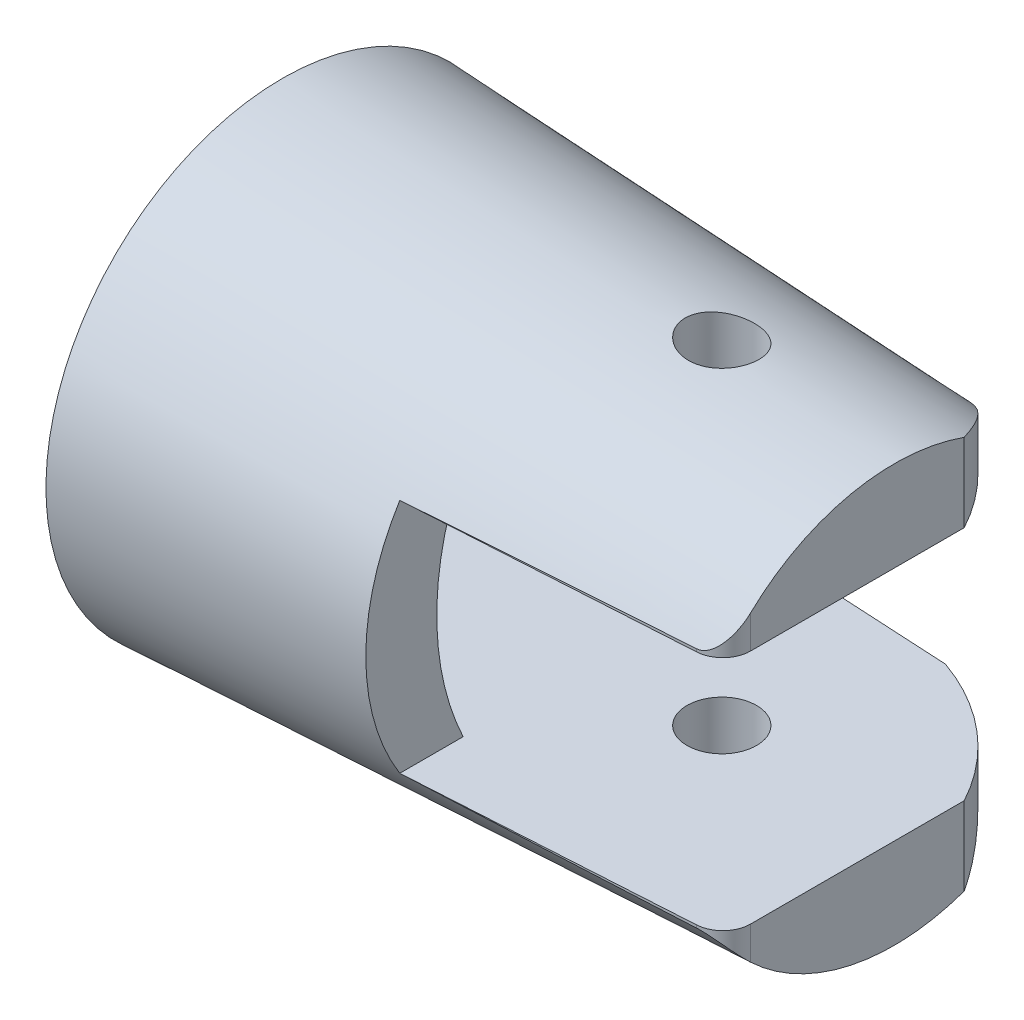
ISO-10303-21;
HEADER;
FILE_DESCRIPTION(('STEP AP214'),'2;1');
FILE_NAME('part.step','',(''),(''),'','','');
FILE_SCHEMA(('AUTOMOTIVE_DESIGN { 1 0 10303 214 1 1 1 1 }'));
ENDSEC;
DATA;
#1=APPLICATION_CONTEXT('core data for automotive mechanical design processes');
#2=APPLICATION_PROTOCOL_DEFINITION('international standard','automotive_design',2000,#1);
#3=PRODUCT_CONTEXT('',#1,'mechanical');
#4=PRODUCT('Part','Part','',(#3));
#5=PRODUCT_RELATED_PRODUCT_CATEGORY('part','',(#4));
#6=PRODUCT_DEFINITION_FORMATION('','',#4);
#7=PRODUCT_DEFINITION_CONTEXT('part definition',#1,'design');
#8=PRODUCT_DEFINITION('design','',#6,#7);
#9=PRODUCT_DEFINITION_SHAPE('','',#8);
#10=(LENGTH_UNIT() NAMED_UNIT(*) SI_UNIT(.MILLI.,.METRE.));
#11=(NAMED_UNIT(*) PLANE_ANGLE_UNIT() SI_UNIT($,.RADIAN.));
#12=(NAMED_UNIT(*) SI_UNIT($,.STERADIAN.) SOLID_ANGLE_UNIT());
#13=UNCERTAINTY_MEASURE_WITH_UNIT(LENGTH_MEASURE(1.E-05),#10,'distance_accuracy_value','');
#14=(GEOMETRIC_REPRESENTATION_CONTEXT(3) GLOBAL_UNCERTAINTY_ASSIGNED_CONTEXT((#13)) GLOBAL_UNIT_ASSIGNED_CONTEXT((#10,
#11,#12)) REPRESENTATION_CONTEXT('',''));
#15=CARTESIAN_POINT('',(0.,0.,0.));
#16=DIRECTION('',(0.,0.,1.));
#17=DIRECTION('',(1.,0.,0.));
#18=AXIS2_PLACEMENT_3D('',#15,#16,#17);
#19=CARTESIAN_POINT('',(9.1685,3.542375,8.335));
#20=DIRECTION('',(1.,0.,0.));
#21=DIRECTION('',(0.,1.,0.));
#22=AXIS2_PLACEMENT_3D('',#19,#20,#21);
#23=PLANE('',#22);
#24=CARTESIAN_POINT('',(9.1685,0.,3.79403656817905));
#25=DIRECTION('',(1.,0.,0.));
#26=DIRECTION('',(0.,1.,0.));
#27=AXIS2_PLACEMENT_3D('',#24,#25,#26);
#28=CIRCLE('',#27,8.335);
#29=CARTESIAN_POINT('',(9.1685,-3.542375,-3.75075));
#30=VERTEX_POINT('',#29);
#31=CARTESIAN_POINT('',(9.1685,3.542375,-3.75075));
#32=VERTEX_POINT('',#31);
#33=EDGE_CURVE('E359',#30,#32,#28,.T.);
#34=ORIENTED_EDGE('',*,*,#33,.F.);
#35=DIRECTION('',(0.,0.,-1.));
#36=VECTOR('',#35,1.);
#37=CARTESIAN_POINT('',(9.1685,-3.542375,8.335));
#38=LINE('',#37,#36);
#39=CARTESIAN_POINT('',(9.1685,-3.542375,-5.64923033336179));
#40=VERTEX_POINT('',#39);
#41=EDGE_CURVE('E238',#30,#40,#38,.T.);
#42=ORIENTED_EDGE('',*,*,#41,.T.);
#43=CARTESIAN_POINT('',(9.1685,0.,0.));
#44=DIRECTION('',(1.,0.,0.));
#45=DIRECTION('',(0.,1.,0.));
#46=AXIS2_PLACEMENT_3D('',#43,#44,#45);
#47=CIRCLE('',#46,6.668);
#48=CARTESIAN_POINT('',(9.1685,3.542375,-5.64923033336179));
#49=VERTEX_POINT('',#48);
#50=EDGE_CURVE('E272',#49,#40,#47,.F.);
#51=ORIENTED_EDGE('',*,*,#50,.F.);
#52=DIRECTION('',(0.,0.,-1.));
#53=VECTOR('',#52,1.);
#54=CARTESIAN_POINT('',(9.1685,3.542375,8.335));
#55=LINE('',#54,#53);
#56=EDGE_CURVE('E243',#32,#49,#55,.T.);
#57=ORIENTED_EDGE('',*,*,#56,.F.);
#58=EDGE_LOOP('',(#34,#42,#51,#57));
#59=FACE_BOUND('',#58,.T.);
#60=ADVANCED_FACE('F37',(#59),#23,.T.);
#61=CARTESIAN_POINT('',(18.337,0.,0.));
#62=DIRECTION('',(-1.,0.,0.));
#63=DIRECTION('',(0.,0.,1.));
#64=AXIS2_PLACEMENT_3D('',#61,#62,#63);
#65=CONICAL_SURFACE('',#64,6.25125,0.0454232794215771);
#66=CARTESIAN_POINT('',(11.9975330316849,6.44021012387023,-1.13470048100918));
#67=CARTESIAN_POINT('',(12.037952493262,6.4308558428648,-1.17720393330202));
#68=CARTESIAN_POINT('',(12.0819888325155,6.42149143549023,-1.21631099414914));
#69=CARTESIAN_POINT('',(12.1761312335468,6.40340763861985,-1.28663655344195));
#70=CARTESIAN_POINT('',(12.2262428039587,6.39468884623862,-1.31784781213434));
#71=CARTESIAN_POINT('',(12.3312160875977,6.37852745058636,-1.37145131256486));
#72=CARTESIAN_POINT('',(12.386080377955,6.37108554630071,-1.39383873265955));
#73=CARTESIAN_POINT('',(12.4989956879317,6.35802492288397,-1.4290291027239));
#74=CARTESIAN_POINT('',(12.5570456520128,6.35240560407275,-1.44183520702256));
#75=CARTESIAN_POINT('',(12.6735963327101,6.34344893443878,-1.45726107121429));
#76=CARTESIAN_POINT('',(12.7320704785145,6.34007261713358,-1.46005868827308));
#77=CARTESIAN_POINT('',(12.848747969712,6.3356068055509,-1.45581514446099));
#78=CARTESIAN_POINT('',(12.9069513385645,6.33451710934135,-1.44877485246977));
#79=CARTESIAN_POINT('',(13.0201837629493,6.33456640943373,-1.42528923992671));
#80=CARTESIAN_POINT('',(13.0752533258961,6.33566046655478,-1.40903838944566));
#81=CARTESIAN_POINT('',(13.1819197905906,6.33973990971466,-1.36775780258779));
#82=CARTESIAN_POINT('',(13.233516610143,6.34272534050235,-1.34272785850864));
#83=CARTESIAN_POINT('',(13.3320838940549,6.35020838574408,-1.28447022966754));
#84=CARTESIAN_POINT('',(13.3790294621528,6.35471362312732,-1.25120144940273));
#85=CARTESIAN_POINT('',(13.4667587398816,6.36473194111713,-1.17746913946979));
#86=CARTESIAN_POINT('',(13.5075417817911,6.37024513079445,-1.13700483118495));
#87=CARTESIAN_POINT('',(13.5826196016023,6.38185425225326,-1.04912065680532));
#88=CARTESIAN_POINT('',(13.6167719067789,6.38795947129503,-1.00158024866946));
#89=CARTESIAN_POINT('',(13.6766549374508,6.40010736520847,-0.901452902173634));
#90=CARTESIAN_POINT('',(13.7023851834252,6.40615003649995,-0.848865676686993));
#91=CARTESIAN_POINT('',(13.7449007349513,6.41774446913314,-0.739570215099756));
#92=CARTESIAN_POINT('',(13.7616012197386,6.42329118030254,-0.68282839974948));
#93=CARTESIAN_POINT('',(13.7851817529798,6.43345104876565,-0.567258567713423));
#94=CARTESIAN_POINT('',(13.7920622436878,6.43806424809303,-0.508430645100016));
#95=CARTESIAN_POINT('',(13.795751470416,6.44610357321565,-0.390779390799092));
#96=CARTESIAN_POINT('',(13.7926281620983,6.44953753366838,-0.33195873105426));
#97=CARTESIAN_POINT('',(13.7765132530748,6.45520708413869,-0.215626773011869));
#98=CARTESIAN_POINT('',(13.7635220726245,6.45744272518371,-0.158115419060677));
#99=CARTESIAN_POINT('',(13.7281658913844,6.46081455774399,-0.046510565799345));
#100=CARTESIAN_POINT('',(13.7058744153958,6.461959146547,0.00760599330426392));
#101=CARTESIAN_POINT('',(13.6525531547727,6.46342849305815,0.1113597436933));
#102=CARTESIAN_POINT('',(13.6215232645148,6.46375324085619,0.160996880825237));
#103=CARTESIAN_POINT('',(13.5515644116032,6.46393316605158,0.254435134525583));
#104=CARTESIAN_POINT('',(13.5126269922696,6.46378783822324,0.298229919223822));
#105=CARTESIAN_POINT('',(13.4279720543599,6.46342871926718,0.37868609950355));
#106=CARTESIAN_POINT('',(13.3822544229344,6.46321492699986,0.41534737633189));
#107=CARTESIAN_POINT('',(13.2851742946482,6.46311620378835,0.480605151965648));
#108=CARTESIAN_POINT('',(13.2337944760281,6.46323231051294,0.509175892137362));
#109=CARTESIAN_POINT('',(13.1269726331767,6.46413609702289,0.557284070790961));
#110=CARTESIAN_POINT('',(13.0715306985112,6.4649237620051,0.576821708374861));
#111=CARTESIAN_POINT('',(12.9582801269343,6.46739805682936,0.606282522627947));
#112=CARTESIAN_POINT('',(12.900476177745,6.46908297899969,0.6162238623417));
#113=CARTESIAN_POINT('',(12.7840571332848,6.47343317499165,0.626286192883299));
#114=CARTESIAN_POINT('',(12.7254420448322,6.47609844057766,0.626407266206895));
#115=CARTESIAN_POINT('',(12.6091427663491,6.48232542626046,0.616854308475685));
#116=CARTESIAN_POINT('',(12.5514574664258,6.48588597787264,0.607192995558153));
#117=CARTESIAN_POINT('',(12.4385509422697,6.49367009410953,0.57838964641172));
#118=CARTESIAN_POINT('',(12.3833298244154,6.49789368732217,0.559247201314009));
#119=CARTESIAN_POINT('',(12.2765955821272,6.50666126424595,0.511903439297456));
#120=CARTESIAN_POINT('',(12.225103455783,6.5112068141797,0.483655072133273));
#121=CARTESIAN_POINT('',(12.1275739195341,6.52013409032122,0.418914096025429));
#122=CARTESIAN_POINT('',(12.0815367135128,6.52451581040148,0.382421179081254));
#123=CARTESIAN_POINT('',(11.9960572404014,6.5326199258377,0.30205134708437));
#124=CARTESIAN_POINT('',(11.9566383968411,6.53633998209702,0.258149264680629));
#125=CARTESIAN_POINT('',(11.8857316713161,6.54259599230176,0.164273995844016));
#126=CARTESIAN_POINT('',(11.8542433078782,6.54513201813971,0.114301178249198));
#127=CARTESIAN_POINT('',(11.8003762245188,6.54856626687841,0.0101844086340991));
#128=CARTESIAN_POINT('',(11.7779179155512,6.54947905306855,-0.043917864653984));
#129=CARTESIAN_POINT('',(11.7423739631063,6.54940476809697,-0.155113236054785));
#130=CARTESIAN_POINT('',(11.7292870846525,6.54841794733063,-0.2122059390211));
#131=CARTESIAN_POINT('',(11.7129611433757,6.54443029012817,-0.326918044188915));
#132=CARTESIAN_POINT('',(11.7095908610613,6.54145696442354,-0.384519786951312));
#133=CARTESIAN_POINT('',(11.7123684390474,6.53356665061155,-0.499367582517678));
#134=CARTESIAN_POINT('',(11.7185180068507,6.52864931393961,-0.556613569663341));
#135=CARTESIAN_POINT('',(11.740108842098,6.51707939569347,-0.669266000352423));
#136=CARTESIAN_POINT('',(11.7555704654358,6.51042303075347,-0.724668132487182));
#137=CARTESIAN_POINT('',(11.7952904164828,6.49575894284288,-0.831994045862872));
#138=CARTESIAN_POINT('',(11.8195422289184,6.48775222309714,-0.883920369684549));
#139=CARTESIAN_POINT('',(11.8686313878517,6.4731149647341,-0.969882231732448));
#140=CARTESIAN_POINT('',(11.8916226257924,6.46667942178841,-1.00502097416058));
#141=CARTESIAN_POINT('',(11.9416384258958,6.45356768815016,-1.07225094762394));
#142=CARTESIAN_POINT('',(11.9686631288509,6.44689148906342,-1.10434207221483));
#143=CARTESIAN_POINT('',(11.9975330316849,6.44021012387023,-1.13470048100918));
#144=B_SPLINE_CURVE_WITH_KNOTS('',3,(#66,#67,#68,#69,#70,#71,#72,#73,#74,#75,#76,#77,#78,#79,
#80,#81,#82,#83,#84,#85,#86,#87,#88,#89,#90,#91,#92,#93,#94,#95,#96,#97,#98,#99,#100,#101,#102,
#103,#104,#105,#106,#107,#108,#109,#110,#111,#112,#113,#114,#115,#116,#117,#118,#119,#120,#121,
#122,#123,#124,#125,#126,#127,#128,#129,#130,#131,#132,#133,#134,#135,#136,#137,#138,#139,#140,
#141,#142,#143),.UNSPECIFIED.,.T.,.F.,(4,2,2,2,2,2,2,2,2,2,2,2,2,2,2,2,2,2,2,2,2,2,2,2,2,2,2,2,
2,2,2,2,2,2,2,2,2,2,4),(0.,0.178034750253364,0.356232155769789,0.534526799816743,
0.71276272043288,0.887815092109863,1.06285200421792,1.23432398581529,1.40580002449792,
1.57814925360992,1.7505171437208,1.92625567443903,2.10200420931698,2.27937615186974,
2.45674010603465,2.63290179120439,2.80905597437396,2.98384317058723,3.1586324795885,
3.33360971021925,3.50858985348712,3.68412099039268,3.8596482581659,4.03484264784606,
4.21003556579488,4.38500100650054,4.55997399315533,4.73586595899823,4.91176449691336,
5.08827301511123,5.26477081458616,5.43967697651824,5.61456008489462,5.78707013053708,
5.95961112157194,6.13253065835197,6.30532228867858,6.43248050140232,6.55964315375707),.UNSPECIFIED.);
#145=CARTESIAN_POINT('',(11.9975330316849,6.44021012387023,-1.13470048100918));
#146=VERTEX_POINT('',#145);
#147=EDGE_CURVE('E175',#146,#146,#144,.T.);
#148=ORIENTED_EDGE('',*,*,#147,.T.);
#149=EDGE_LOOP('',(#148));
#150=FACE_BOUND('',#149,.T.);
#151=CARTESIAN_POINT('',(0.,0.,0.));
#152=DIRECTION('',(1.,0.,0.));
#153=DIRECTION('',(0.,0.,-1.));
#154=AXIS2_PLACEMENT_3D('',#151,#152,#153);
#155=CIRCLE('',#154,7.08475);
#156=CARTESIAN_POINT('',(0.,0.,-7.08475));
#157=VERTEX_POINT('',#156);
#158=EDGE_CURVE('E319',#157,#157,#155,.T.);
#159=ORIENTED_EDGE('',*,*,#158,.T.);
#160=EDGE_LOOP('',(#159));
#161=FACE_BOUND('',#160,.T.);
#162=CARTESIAN_POINT('',(18.337,0.,0.));
#163=DIRECTION('',(1.,0.,0.));
#164=DIRECTION('',(0.,0.,-1.));
#165=AXIS2_PLACEMENT_3D('',#162,#163,#164);
#166=CIRCLE('',#165,6.25125);
#167=CARTESIAN_POINT('',(18.337,-4.53325798412864,4.3043820168495));
#168=VERTEX_POINT('',#167);
#169=CARTESIAN_POINT('',(18.3369999999998,-5.88857005723886,-2.09830151396077));
#170=VERTEX_POINT('',#169);
#171=EDGE_CURVE('E42',#168,#170,#166,.T.);
#172=ORIENTED_EDGE('',*,*,#171,.F.);
#173=CARTESIAN_POINT('',(18.3369999999997,-4.53325763985251,4.30438169000137));
#174=CARTESIAN_POINT('',(18.3369900007714,-4.50192048538153,4.33739235121856));
#175=CARTESIAN_POINT('',(18.3350391930366,-4.47028886542983,4.37010635637796));
#176=CARTESIAN_POINT('',(18.3273878209806,-4.40666071083246,4.43474608374184));
#177=CARTESIAN_POINT('',(18.3216865191009,-4.37466410562658,4.46667164961321));
#178=CARTESIAN_POINT('',(18.3065997019521,-4.31025893903593,4.52980434711775));
#179=CARTESIAN_POINT('',(18.2971820469495,-4.27784923707475,4.56100262692781));
#180=CARTESIAN_POINT('',(18.274718911652,-4.21317198289614,4.62219568694036));
#181=CARTESIAN_POINT('',(18.2616741576944,-4.18090440353107,4.65219070672457));
#182=CARTESIAN_POINT('',(18.2230281934887,-4.09758494102622,4.728375157145));
#183=CARTESIAN_POINT('',(18.194585091219,-4.04685212879633,4.77350952270902));
#184=CARTESIAN_POINT('',(18.1278359269416,-3.94829582715106,4.8592456647482));
#185=CARTESIAN_POINT('',(18.089565345878,-3.90046262140486,4.89986300871111));
#186=CARTESIAN_POINT('',(18.0199014798341,-3.82922354786201,4.9595143364171));
#187=CARTESIAN_POINT('',(17.9921900301683,-3.80388462810826,4.98053690417486));
#188=CARTESIAN_POINT('',(17.9324747598755,-3.75630114421072,5.01991033981236));
#189=CARTESIAN_POINT('',(17.9004747881006,-3.73405384146176,5.03826357291308));
#190=CARTESIAN_POINT('',(17.8397141142586,-3.69875170673444,5.06763087124837));
#191=CARTESIAN_POINT('',(17.811856580005,-3.68475574216892,5.07936610939416));
#192=CARTESIAN_POINT('',(17.7536207842187,-3.66059450726754,5.10006470006303));
#193=CARTESIAN_POINT('',(17.7232516440859,-3.65041605924361,5.10903756842506));
#194=CARTESIAN_POINT('',(17.6697776545947,-3.63718401084076,5.12144280344581));
#195=CARTESIAN_POINT('',(17.6471710193752,-3.63291453825757,5.12572871478402));
#196=CARTESIAN_POINT('',(17.6012115911903,-3.62700726506419,5.13246725113647));
#197=CARTESIAN_POINT('',(17.5778551040058,-3.62538558452629,5.13490859825751));
#198=CARTESIAN_POINT('',(17.5543839577023,-3.62522922712269,5.13632769823078));
#199=B_SPLINE_CURVE_WITH_KNOTS('',3,(#173,#174,#175,#176,#177,#178,#179,#180,#181,#182,#183,
#184,#185,#186,#187,#188,#189,#190,#191,#192,#193,#194,#195,#196,#197,#198),.UNSPECIFIED.,.F.,
.F.,(4,2,2,2,2,2,2,2,2,2,2,2,4),(0.,0.136487294692898,0.273001438504428,0.410723008082523,
0.548417018346906,0.768542799688642,0.987884751057104,1.11668829776924,1.24537701080498,
1.34497276483026,1.44422148893831,1.51420763269631,1.58461829281813),.UNSPECIFIED.);
#200=CARTESIAN_POINT('',(17.5543839577023,-3.62522922712282,5.13632769823078));
#201=VERTEX_POINT('',#200);
#202=EDGE_CURVE('E311',#168,#201,#199,.T.);
#203=ORIENTED_EDGE('',*,*,#202,.T.);
#204=CARTESIAN_POINT('',(34.5041081604014,0.,4.09963815516557));
#205=DIRECTION('',(0.0610485395348605,0.,0.998134798421867));
#206=DIRECTION('',(-0.998134798421867,0.,0.0610485395348605));
#207=AXIS2_PLACEMENT_3D('',#204,#205,#206);
#208=ELLIPSE('',#207,90.3605801102733,3.69099326311024);
#209=CARTESIAN_POINT('',(9.1685,-3.542375,5.64923033336179));
#210=VERTEX_POINT('',#209);
#211=EDGE_CURVE('E382',#201,#210,#208,.F.);
#212=ORIENTED_EDGE('',*,*,#211,.T.);
#213=CARTESIAN_POINT('',(9.1685,3.542375,5.64923033336179));
#214=VERTEX_POINT('',#213);
#215=EDGE_CURVE('E267',#210,#214,#47,.F.);
#216=ORIENTED_EDGE('',*,*,#215,.T.);
#217=CARTESIAN_POINT('',(17.5543839577024,3.62522922712282,5.13632769823078));
#218=VERTEX_POINT('',#217);
#219=EDGE_CURVE('E379',#214,#218,#208,.F.);
#220=ORIENTED_EDGE('',*,*,#219,.T.);
#221=CARTESIAN_POINT('',(17.5543839577023,3.62522922712282,5.13632769823078));
#222=CARTESIAN_POINT('',(17.5835191435355,3.62539717459503,5.13458204197887));
#223=CARTESIAN_POINT('',(17.6124407533959,3.62785684995635,5.13124299283005));
#224=CARTESIAN_POINT('',(17.6688884168199,3.63675828304936,5.12179446868215));
#225=CARTESIAN_POINT('',(17.696426051236,3.64315736018139,5.11571487211695));
#226=CARTESIAN_POINT('',(17.756397235893,3.66137164352762,5.09934388125483));
#227=CARTESIAN_POINT('',(17.7883530178643,3.67413604047359,5.08838211572724));
#228=CARTESIAN_POINT('',(17.849230934616,3.70364974125854,5.0635134527767));
#229=CARTESIAN_POINT('',(17.878138434752,3.720417109855,5.04959323655002));
#230=CARTESIAN_POINT('',(17.9467530692136,3.76604460672442,5.0118236941097));
#231=CARTESIAN_POINT('',(17.9844507795672,3.7967112796795,4.98653080374656));
#232=CARTESIAN_POINT('',(18.0533650839514,3.86181066792532,4.93231314277606));
#233=CARTESIAN_POINT('',(18.0845679294244,3.89625114130659,4.90338087164891));
#234=CARTESIAN_POINT('',(18.1560385241076,3.9859802052676,4.826803750027));
#235=CARTESIAN_POINT('',(18.1924803505367,4.04273127487289,4.77730173260929));
#236=CARTESIAN_POINT('',(18.2532359610207,4.15817705163776,4.67347504779415));
#237=CARTESIAN_POINT('',(18.2775417639236,4.21687301085594,4.61914723433887));
#238=CARTESIAN_POINT('',(18.3094053683784,4.31896465012732,4.52149820301435));
#239=CARTESIAN_POINT('',(18.319683239889,4.36233779023442,4.47902489375341));
#240=CARTESIAN_POINT('',(18.3334494794043,4.44840121574794,4.39267745596559));
#241=CARTESIAN_POINT('',(18.336965415419,4.49109356705386,4.3488097596933));
#242=CARTESIAN_POINT('',(18.3369999999996,4.53325778555096,4.30438153655573));
#243=B_SPLINE_CURVE_WITH_KNOTS('',3,(#221,#222,#223,#224,#225,#226,#227,#228,#229,#230,#231,
#232,#233,#234,#235,#236,#237,#238,#239,#240,#241,#242),.UNSPECIFIED.,.F.,.F.,(4,2,2,2,2,2,2,2,
2,2,4),(0.,0.0872788149635096,0.173628274098218,0.28137544666744,0.389618375482222,
0.553055908841991,0.71683597092699,0.966494825302897,1.21631765014758,1.40065316914789,
1.58423555666855),.UNSPECIFIED.);
#244=CARTESIAN_POINT('',(18.337,4.5332582105823,4.30438194017639));
#245=VERTEX_POINT('',#244);
#246=EDGE_CURVE('E388',#218,#245,#243,.T.);
#247=ORIENTED_EDGE('',*,*,#246,.T.);
#248=CARTESIAN_POINT('',(18.3369999999999,5.88857005723891,-2.09830151396063));
#249=VERTEX_POINT('',#248);
#250=EDGE_CURVE('E278',#249,#245,#166,.T.);
#251=ORIENTED_EDGE('',*,*,#250,.F.);
#252=CARTESIAN_POINT('',(18.3372567700001,5.8887272452361,-2.09782555819744));
#253=CARTESIAN_POINT('',(18.2437556313909,5.83149743685913,-2.27116472232102));
#254=CARTESIAN_POINT('',(18.1438201709411,5.76811377678709,-2.43879346040231));
#255=CARTESIAN_POINT('',(17.9326160884122,5.63121433688765,-2.76195151827652));
#256=CARTESIAN_POINT('',(17.8213666244223,5.55771561280008,-2.91750053010643));
#257=CARTESIAN_POINT('',(17.5890978521601,5.40278961725154,-3.21595306997522));
#258=CARTESIAN_POINT('',(17.4681088124401,5.32138675906085,-3.35889308713651));
#259=CARTESIAN_POINT('',(17.2170417254225,5.15234598352332,-3.63268108985652));
#260=CARTESIAN_POINT('',(17.0869597327341,5.06470535933413,-3.76352376852447));
#261=CARTESIAN_POINT('',(16.8194222295558,4.88570920270175,-4.01228697614881));
#262=CARTESIAN_POINT('',(16.682023019467,4.79438306222491,-4.13028950280044));
#263=CARTESIAN_POINT('',(16.3994896285615,4.60934677194497,-4.35453372118011));
#264=CARTESIAN_POINT('',(16.2543560050093,4.51563679415094,-4.46077625852275));
#265=CARTESIAN_POINT('',(15.956602954054,4.32798640050813,-4.66153931102511));
#266=CARTESIAN_POINT('',(15.8039907675171,4.23404628806296,-4.75607086380206));
#267=CARTESIAN_POINT('',(15.4909122045477,4.04829716249752,-4.9335580472138));
#268=CARTESIAN_POINT('',(15.3304463805982,3.95648800013837,-5.01651449055108));
#269=CARTESIAN_POINT('',(15.0579838932309,3.80903484694913,-5.14402410710328));
#270=CARTESIAN_POINT('',(14.9483885448769,3.75185182294459,-5.19194533225433));
#271=CARTESIAN_POINT('',(14.7254074766565,3.64100752113077,-5.28258333407961));
#272=CARTESIAN_POINT('',(14.6120241011872,3.58734412382096,-5.3253032564752));
#273=CARTESIAN_POINT('',(14.3810492660779,3.48489812621754,-5.40539388018345));
#274=CARTESIAN_POINT('',(14.263454011829,3.43612008551145,-5.4427595980757));
#275=CARTESIAN_POINT('',(14.0238331415782,3.34531821350155,-5.51179136932712));
#276=CARTESIAN_POINT('',(13.9018003089855,3.30330604795549,-5.54344758937247));
#277=CARTESIAN_POINT('',(13.7775883,3.26567337687366,-5.57203264540453));
#278=B_SPLINE_CURVE_WITH_KNOTS('',3,(#252,#253,#254,#255,#256,#257,#258,#259,#260,#261,#262,
#263,#264,#265,#266,#267,#268,#269,#270,#271,#272,#273,#274,#275,#276,#277),.UNSPECIFIED.,.F.,
.F.,(4,2,2,2,2,2,2,2,2,2,2,2,4),(0.,0.614761797547903,1.22849941956888,1.84039831179014,
2.45256437222132,3.06055796412108,3.66850780915208,4.27588022953787,4.88320998408708,
5.2807796843978,5.67810772943092,6.0758032178997,6.47417723872426),.UNSPECIFIED.);
#279=CARTESIAN_POINT('',(14.5105999521249,3.542375,-5.36045542592328));
#280=VERTEX_POINT('',#279);
#281=EDGE_CURVE('E233',#249,#280,#278,.T.);
#282=ORIENTED_EDGE('',*,*,#281,.T.);
#283=CARTESIAN_POINT('',(35.2145239719041,3.542375,-4.18650456912061));
#284=CARTESIAN_POINT('',(33.4689798185685,3.542375,-4.29041241927889));
#285=CARTESIAN_POINT('',(31.7233440938123,3.542375,-4.39276675358282));
#286=CARTESIAN_POINT('',(28.2319248412182,3.542375,-4.5948589560641));
#287=CARTESIAN_POINT('',(26.4861413137063,3.542375,-4.69459682986908));
#288=CARTESIAN_POINT('',(22.0366149811897,3.542375,-4.94608423535791));
#289=CARTESIAN_POINT('',(19.3327882979208,3.542375,-5.09634776882417));
#290=CARTESIAN_POINT('',(13.9249199355782,3.542375,-5.39297364008887));
#291=CARTESIAN_POINT('',(11.2208782563778,3.542375,-5.53933597557063));
#292=CARTESIAN_POINT('',(5.81261229454533,3.542375,-5.82899950095595));
#293=CARTESIAN_POINT('',(3.10838801077011,3.542375,-5.97230066947658));
#294=CARTESIAN_POINT('',(-2.30018797093893,3.542375,-6.25640839517562));
#295=CARTESIAN_POINT('',(-5.00453966869321,3.542375,-6.39721495576955));
#296=CARTESIAN_POINT('',(-7.70894062190416,3.542375,-6.53705820162685));
#297=B_SPLINE_CURVE_WITH_KNOTS('',3,(#283,#284,#285,#286,#287,#288,#289,#290,#291,#292,#293,
#294,#295,#296),.UNSPECIFIED.,.F.,.F.,(4,2,2,2,2,2,4),(0.,5.24590028454247,10.4917892849977,
18.6157819821045,26.7397795034309,34.8638337541246,42.9878768807833),.UNSPECIFIED.);
#298=EDGE_CURVE('E269',#280,#49,#297,.T.);
#299=ORIENTED_EDGE('',*,*,#298,.T.);
#300=ORIENTED_EDGE('',*,*,#50,.T.);
#301=CARTESIAN_POINT('',(-7.70894062190416,-3.542375,-6.53705820162685));
#302=CARTESIAN_POINT('',(-5.34136437674105,-3.542375,-6.41464077103996));
#303=CARTESIAN_POINT('',(-2.97382657835841,-3.542375,-6.29147422101618));
#304=CARTESIAN_POINT('',(1.76114674899523,-3.542375,-6.04328086722643));
#305=CARTESIAN_POINT('',(4.12858227815992,-3.542375,-5.91825406715388));
#306=CARTESIAN_POINT('',(8.88951329233916,-3.542375,-5.66458289247028));
#307=CARTESIAN_POINT('',(11.2830074625838,-3.542375,-5.53591380300668));
#308=CARTESIAN_POINT('',(16.0698432043344,-3.542375,-5.27577752322633));
#309=CARTESIAN_POINT('',(18.463184775885,-3.542375,-5.14431033373396));
#310=CARTESIAN_POINT('',(23.2496830764965,-3.542375,-4.87787263022865));
#311=CARTESIAN_POINT('',(25.6428398047839,-3.542375,-4.7429021022772));
#312=CARTESIAN_POINT('',(29.2323822022292,-3.542375,-4.53706088482476));
#313=CARTESIAN_POINT('',(30.4288649438516,-3.542375,-4.46788286514102));
#314=CARTESIAN_POINT('',(32.8217544457568,-3.542375,-4.32821921009523));
#315=CARTESIAN_POINT('',(34.0181612060159,-3.542375,-4.25773357432816));
#316=CARTESIAN_POINT('',(35.2145239719042,-3.542375,-4.18650456912061));
#317=B_SPLINE_CURVE_WITH_KNOTS('',3,(#301,#302,#303,#304,#305,#306,#307,#308,#309,#310,#311,
#312,#313,#314,#315,#316),.UNSPECIFIED.,.F.,.F.,(4,2,2,2,2,2,2,4),(0.,7.11221723988195,
14.2244203607457,21.4152694802321,28.6061164811368,35.79699209619,39.3924342611635,
42.9878775398138),.UNSPECIFIED.);
#318=CARTESIAN_POINT('',(14.5105999521249,-3.542375,-5.36045542592329));
#319=VERTEX_POINT('',#318);
#320=EDGE_CURVE('E323',#40,#319,#317,.T.);
#321=ORIENTED_EDGE('',*,*,#320,.T.);
#322=CARTESIAN_POINT('',(13.7775883,-3.26567337687366,-5.57203264540453));
#323=CARTESIAN_POINT('',(13.8741602660609,-3.2949060945751,-5.54981469099037));
#324=CARTESIAN_POINT('',(13.9694206937328,-3.32681950954608,-5.52573130847066));
#325=CARTESIAN_POINT('',(14.1572880190488,-3.39502911691917,-5.47404020806985));
#326=CARTESIAN_POINT('',(14.2498972106921,-3.43132136940431,-5.44643565714568));
#327=CARTESIAN_POINT('',(14.523390107443,-3.54515171492216,-5.35876657346908));
#328=CARTESIAN_POINT('',(14.7005374459807,-3.62783656490893,-5.29370643470144));
#329=CARTESIAN_POINT('',(15.0459330519769,-3.80134027916574,-5.15104148923577));
#330=CARTESIAN_POINT('',(15.2141610323169,-3.89217651901559,-5.07340958697032));
#331=CARTESIAN_POINT('',(15.5423243555129,-4.0779012068246,-4.90599469207648));
#332=CARTESIAN_POINT('',(15.7022524061468,-4.17279308890029,-4.8162012563356));
#333=CARTESIAN_POINT('',(16.0123358422499,-4.36247996768717,-4.62568743973183));
#334=CARTESIAN_POINT('',(16.1625815994437,-4.45726382163807,-4.52510276177491));
#335=CARTESIAN_POINT('',(16.4552965714004,-4.64548094490138,-4.31213024196491));
#336=CARTESIAN_POINT('',(16.5977676571797,-4.73891453514733,-4.19974525912513));
#337=CARTESIAN_POINT('',(16.8743429341009,-4.92222048800794,-3.9633054504168));
#338=CARTESIAN_POINT('',(17.008468089181,-5.01210154799795,-3.83928200421866));
#339=CARTESIAN_POINT('',(17.2681283157972,-5.18666731543657,-3.57923281607178));
#340=CARTESIAN_POINT('',(17.3936651584913,-5.27135309392792,-3.44320956215812));
#341=CARTESIAN_POINT('',(17.6683876817536,-5.45589625350066,-3.12018084347908));
#342=CARTESIAN_POINT('',(17.8146654229589,-5.55357844354023,-2.92939903121892));
#343=CARTESIAN_POINT('',(18.0898417440434,-5.73373703474411,-2.52814973423226));
#344=CARTESIAN_POINT('',(18.2186859912305,-5.81616617939917,-2.31762401792518));
#345=CARTESIAN_POINT('',(18.3372567700001,-5.8887272452361,-2.09782555819743));
#346=B_SPLINE_CURVE_WITH_KNOTS('',3,(#322,#323,#324,#325,#326,#327,#328,#329,#330,#331,#332,
#333,#334,#335,#336,#337,#338,#339,#340,#341,#342,#343,#344,#345),.UNSPECIFIED.,.F.,.F.,(4,2,2,
2,2,2,2,2,2,2,2,4),(0.,0.309788168993802,0.619299651979857,1.23640099891977,1.85485051498471,
2.47383450124324,3.08578754533568,3.69759266423965,4.3077931955312,4.91786750412883,
5.69459989930568,6.47369986170819),.UNSPECIFIED.);
#347=EDGE_CURVE('E400',#319,#170,#346,.T.);
#348=ORIENTED_EDGE('',*,*,#347,.T.);
#349=EDGE_LOOP('',(#172,#203,#212,#216,#220,#247,#251,#282,#299,#300,#321,#348));
#350=FACE_BOUND('',#349,.T.);
#351=CARTESIAN_POINT('',(11.9975330316849,-6.44021012387023,-1.13470048100918));
#352=CARTESIAN_POINT('',(11.9570986688127,-6.44956833752718,-1.09217570892599));
#353=CARTESIAN_POINT('',(11.9202400827763,-6.45892640902424,-1.04620497507465));
#354=CARTESIAN_POINT('',(11.8547152810519,-6.47699236331857,-0.94859326725954));
#355=CARTESIAN_POINT('',(11.8260565471414,-6.48569964700186,-0.896947174017417));
#356=CARTESIAN_POINT('',(11.7777990287459,-6.50188004801848,-0.789362125548483));
#357=CARTESIAN_POINT('',(11.758204498976,-6.50935258470893,-0.73342116865886));
#358=CARTESIAN_POINT('',(11.7287549739947,-6.52258642980903,-0.618849374394377));
#359=CARTESIAN_POINT('',(11.7188969659518,-6.52834826718463,-0.560219374986461));
#360=CARTESIAN_POINT('',(11.7093702703661,-6.53777886767604,-0.442929239243889));
#361=CARTESIAN_POINT('',(11.7095396221042,-6.54147992617541,-0.384284876651232));
#362=CARTESIAN_POINT('',(11.7197258514998,-6.54682132424968,-0.267762425326016));
#363=CARTESIAN_POINT('',(11.7297420893127,-6.54846179770436,-0.209884287052323));
#364=CARTESIAN_POINT('',(11.7590959211702,-6.54975536230999,-0.097590386945628));
#365=CARTESIAN_POINT('',(11.7782699765882,-6.5494422006783,-0.043132157179711));
#366=CARTESIAN_POINT('',(11.8253187949693,-6.54715402990251,0.061846397035003));
#367=CARTESIAN_POINT('',(11.8531936861851,-6.54517899626123,0.112366663423403));
#368=CARTESIAN_POINT('',(11.9169631982317,-6.53993196641088,0.208250529208585));
#369=CARTESIAN_POINT('',(11.9528867002967,-6.53665526578667,0.253594647439512));
#370=CARTESIAN_POINT('',(12.0316886655376,-6.52926449846994,0.337692669843985));
#371=CARTESIAN_POINT('',(12.074567688055,-6.52515036442683,0.376446043496422));
#372=CARTESIAN_POINT('',(12.1667619926032,-6.51651169013001,0.446827719102587));
#373=CARTESIAN_POINT('',(12.2161599195792,-6.51198215752278,0.478347194402832));
#374=CARTESIAN_POINT('',(12.3195431784058,-6.50304855052373,0.532680850621259));
#375=CARTESIAN_POINT('',(12.3735286634513,-6.4986444803281,0.555494740689451));
#376=CARTESIAN_POINT('',(12.4849199164193,-6.49034838154378,0.591877823031691));
#377=CARTESIAN_POINT('',(12.542343740155,-6.4864594778534,0.605392512020449));
#378=CARTESIAN_POINT('',(12.6586968225756,-6.47952198229236,0.622554048318577));
#379=CARTESIAN_POINT('',(12.7176260270052,-6.47647336018376,0.626201250755755));
#380=CARTESIAN_POINT('',(12.8349939000188,-6.47137368506577,0.623506854877409));
#381=CARTESIAN_POINT('',(12.8934335303592,-6.46931756263054,0.617216734014959));
#382=CARTESIAN_POINT('',(13.0084511485458,-6.46615691038835,0.594906882658498));
#383=CARTESIAN_POINT('',(13.0650291672127,-6.46505236481946,0.578887313330725));
#384=CARTESIAN_POINT('',(13.1744889848445,-6.4636190337829,0.537649632161238));
#385=CARTESIAN_POINT('',(13.2273840600339,-6.46328730519636,0.512466841901622));
#386=CARTESIAN_POINT('',(13.3282164766509,-6.46308973132443,0.453606075467686));
#387=CARTESIAN_POINT('',(13.3761537172101,-6.46322389551582,0.419927926500871));
#388=CARTESIAN_POINT('',(13.4658243743153,-6.46357783324892,0.344937191366398));
#389=CARTESIAN_POINT('',(13.5075427875368,-6.46379780934082,0.30360666471674));
#390=CARTESIAN_POINT('',(13.5834580808864,-6.46391372826826,0.214534004261023));
#391=CARTESIAN_POINT('',(13.6176549719372,-6.46380967157435,0.166791879766));
#392=CARTESIAN_POINT('',(13.6775761972416,-6.46289810798663,0.0662185332155573));
#393=CARTESIAN_POINT('',(13.7032948138112,-6.46209012770437,0.0133839077242196));
#394=CARTESIAN_POINT('',(13.745495336829,-6.45947457456008,-0.095829541637381));
#395=CARTESIAN_POINT('',(13.7619775648419,-6.457667036502,-0.152208242044665));
#396=CARTESIAN_POINT('',(13.7852056175608,-6.45289485868027,-0.266670986023882));
#397=CARTESIAN_POINT('',(13.791987211217,-6.44993452127371,-0.324747954646237));
#398=CARTESIAN_POINT('',(13.7957658165817,-6.44284776149042,-0.441147102405888));
#399=CARTESIAN_POINT('',(13.7927627798994,-6.43872133334676,-0.499469282754478));
#400=CARTESIAN_POINT('',(13.7770884305788,-6.42945309547784,-0.614773491204313));
#401=CARTESIAN_POINT('',(13.7644075588275,-6.42431028556328,-0.671754136829957));
#402=CARTESIAN_POINT('',(13.7297557989168,-6.41332053780576,-0.782745880451553));
#403=CARTESIAN_POINT('',(13.7077842845993,-6.40747355252275,-0.836756778019167));
#404=CARTESIAN_POINT('',(13.6549326751083,-6.39545553065601,-0.940816085360605));
#405=CARTESIAN_POINT('',(13.6239734062046,-6.38928203131035,-0.990824007378528));
#406=CARTESIAN_POINT('',(13.5540764332021,-6.37719647532842,-1.08495329554123));
#407=CARTESIAN_POINT('',(13.5151383389587,-6.37128443149387,-1.12907437365973));
#408=CARTESIAN_POINT('',(13.4301628394435,-6.36027722806159,-1.21035878594822));
#409=CARTESIAN_POINT('',(13.3840974103358,-6.35518546238587,-1.24749331425915));
#410=CARTESIAN_POINT('',(13.2862572437979,-6.34641639233598,-1.31348914692041));
#411=CARTESIAN_POINT('',(13.2344830326974,-6.34273895770552,-1.34235121308101));
#412=CARTESIAN_POINT('',(13.1274312220408,-6.33731862083571,-1.39059186964893));
#413=CARTESIAN_POINT('',(13.0722098906173,-6.3355504463669,-1.41009240272405));
#414=CARTESIAN_POINT('',(12.9592615445402,-6.33418102764147,-1.43957901238648));
#415=CARTESIAN_POINT('',(12.9015349470788,-6.33457942395724,-1.44956666680882));
#416=CARTESIAN_POINT('',(12.7863611108712,-6.33763576215671,-1.45965026679164));
#417=CARTESIAN_POINT('',(12.7289283105801,-6.34025195072533,-1.45992501759454));
#418=CARTESIAN_POINT('',(12.6149205772681,-6.34759876663175,-1.45107640030796));
#419=CARTESIAN_POINT('',(12.5583458061851,-6.35232978809656,-1.4419512800148));
#420=CARTESIAN_POINT('',(12.4474927542659,-6.36363728298499,-1.41460386143009));
#421=CARTESIAN_POINT('',(12.3932205098292,-6.37021829918584,-1.39635908233563));
#422=CARTESIAN_POINT('',(12.2885756008446,-6.38478001120806,-1.35134695996384));
#423=CARTESIAN_POINT('',(12.2382001361544,-6.39275968825895,-1.32458580843326));
#424=CARTESIAN_POINT('',(12.1551762000877,-6.4073635224833,-1.27138549359904));
#425=CARTESIAN_POINT('',(12.1213478196816,-6.41379292585101,-1.24670934553047));
#426=CARTESIAN_POINT('',(12.0569197367937,-6.4268849454315,-1.19350460826665));
#427=CARTESIAN_POINT('',(12.0263201595773,-6.43354757067906,-1.16497586970322));
#428=CARTESIAN_POINT('',(11.9975330316849,-6.44021012387023,-1.13470048100918));
#429=B_SPLINE_CURVE_WITH_KNOTS('',3,(#351,#352,#353,#354,#355,#356,#357,#358,#359,#360,#361,
#362,#363,#364,#365,#366,#367,#368,#369,#370,#371,#372,#373,#374,#375,#376,#377,#378,#379,#380,
#381,#382,#383,#384,#385,#386,#387,#388,#389,#390,#391,#392,#393,#394,#395,#396,#397,#398,#399,
#400,#401,#402,#403,#404,#405,#406,#407,#408,#409,#410,#411,#412,#413,#414,#415,#416,#417,#418,
#419,#420,#421,#422,#423,#424,#425,#426,#427,#428),.UNSPECIFIED.,.T.,.F.,(4,2,2,2,2,2,2,2,2,2,2,
2,2,2,2,2,2,2,2,2,2,2,2,2,2,2,2,2,2,2,2,2,2,2,2,2,2,2,4),(0.,0.178113075505007,
0.356388151914828,0.534746825502739,0.713050291167372,0.888474618586891,1.06388754779381,
1.23627887240494,1.40867273823226,1.58169541344442,1.7547320095086,1.93022228350306,
2.10571842004156,2.28223458558666,2.45874439828473,2.63434284653441,2.80993838611257,
2.98486410425249,3.15979338060459,3.33513808261456,3.51048252998864,3.68594498756252,
3.86140133603148,4.03620904531548,4.21101761912967,4.38599908089072,4.56099233769407,
4.73757649286256,4.91416928461807,5.09147494258253,5.26876426723527,5.44367696709564,
5.61856065034842,5.79022318291469,5.961917720405,6.13403760369355,6.30603263367147,
6.43283480583543,6.55964189563846),.UNSPECIFIED.);
#430=CARTESIAN_POINT('',(11.9975330316849,-6.44021012387023,-1.13470048100918));
#431=VERTEX_POINT('',#430);
#432=EDGE_CURVE('E183',#431,#431,#429,.T.);
#433=ORIENTED_EDGE('',*,*,#432,.T.);
#434=EDGE_LOOP('',(#433));
#435=FACE_BOUND('',#434,.T.);
#436=ADVANCED_FACE('F188',(#150,#161,#350,#435),#65,.T.);
#437=CARTESIAN_POINT('',(18.337,0.,0.));
#438=DIRECTION('',(1.,0.,0.));
#439=DIRECTION('',(0.,0.,-1.));
#440=AXIS2_PLACEMENT_3D('',#437,#438,#439);
#441=PLANE('',#440);
#442=ORIENTED_EDGE('',*,*,#250,.T.);
#443=DIRECTION('',(0.,-1.,0.));
#444=VECTOR('',#443,1.);
#445=CARTESIAN_POINT('',(18.337,0.,4.30438234374615));
#446=LINE('',#445,#444);
#447=CARTESIAN_POINT('',(18.337,3.542375,4.30438234374615));
#448=VERTEX_POINT('',#447);
#449=EDGE_CURVE('E317',#245,#448,#446,.T.);
#450=ORIENTED_EDGE('',*,*,#449,.T.);
#451=DIRECTION('',(0.,0.,-1.));
#452=VECTOR('',#451,1.);
#453=CARTESIAN_POINT('',(18.337,3.542375,0.));
#454=LINE('',#453,#452);
#455=CARTESIAN_POINT('',(18.337,3.542375,-2.09830151396038));
#456=VERTEX_POINT('',#455);
#457=EDGE_CURVE('E256',#448,#456,#454,.T.);
#458=ORIENTED_EDGE('',*,*,#457,.T.);
#459=DIRECTION('',(0.,-1.,0.));
#460=VECTOR('',#459,1.);
#461=CARTESIAN_POINT('',(18.337,8.335,-2.09830151396038));
#462=LINE('',#461,#460);
#463=EDGE_CURVE('E235',#456,#249,#462,.F.);
#464=ORIENTED_EDGE('',*,*,#463,.T.);
#465=EDGE_LOOP('',(#442,#450,#458,#464));
#466=FACE_BOUND('',#465,.T.);
#467=ADVANCED_FACE('F290',(#466),#441,.T.);
#468=DIRECTION('',(0.,0.,1.));
#469=VECTOR('',#468,1.);
#470=CARTESIAN_POINT('',(18.337,-3.542375,0.));
#471=LINE('',#470,#469);
#472=CARTESIAN_POINT('',(18.337,-3.542375,-2.09830151396038));
#473=VERTEX_POINT('',#472);
#474=CARTESIAN_POINT('',(18.337,-3.542375,4.30438234374615));
#475=VERTEX_POINT('',#474);
#476=EDGE_CURVE('E247',#473,#475,#471,.T.);
#477=ORIENTED_EDGE('',*,*,#476,.T.);
#478=DIRECTION('',(0.,-1.,0.));
#479=VECTOR('',#478,1.);
#480=CARTESIAN_POINT('',(18.337,0.,4.30438234374615));
#481=LINE('',#480,#479);
#482=EDGE_CURVE('E364',#475,#168,#481,.T.);
#483=ORIENTED_EDGE('',*,*,#482,.T.);
#484=ORIENTED_EDGE('',*,*,#171,.T.);
#485=DIRECTION('',(0.,-1.,0.));
#486=VECTOR('',#485,1.);
#487=CARTESIAN_POINT('',(18.337,8.335,-2.09830151396038));
#488=LINE('',#487,#486);
#489=EDGE_CURVE('E401',#170,#473,#488,.F.);
#490=ORIENTED_EDGE('',*,*,#489,.T.);
#491=EDGE_LOOP('',(#477,#483,#484,#490));
#492=FACE_BOUND('',#491,.T.);
#493=ADVANCED_FACE('F298',(#492),#441,.T.);
#494=CARTESIAN_POINT('',(20.6403022955739,3.542375,8.335));
#495=DIRECTION('',(0.,-1.,0.));
#496=DIRECTION('',(1.,0.,0.));
#497=AXIS2_PLACEMENT_3D('',#494,#495,#496);
#498=PLANE('',#497);
#499=ORIENTED_EDGE('',*,*,#457,.F.);
#500=CARTESIAN_POINT('',(17.5035,3.542375,4.30438234374615));
#501=DIRECTION('',(0.,-1.,0.));
#502=DIRECTION('',(1.,0.,0.));
#503=AXIS2_PLACEMENT_3D('',#500,#501,#502);
#504=CIRCLE('',#503,0.8335);
#505=CARTESIAN_POINT('',(17.5543839577023,3.542375,5.13632769823078));
#506=VERTEX_POINT('',#505);
#507=EDGE_CURVE('E48',#448,#506,#504,.T.);
#508=ORIENTED_EDGE('',*,*,#507,.T.);
#509=DIRECTION('',(-0.998134798421867,0.,0.0610485395348605));
#510=VECTOR('',#509,1.);
#511=CARTESIAN_POINT('',(20.4338912653126,3.542375,4.96020948655485));
#512=LINE('',#511,#510);
#513=EDGE_CURVE('E395',#506,#214,#512,.T.);
#514=ORIENTED_EDGE('',*,*,#513,.T.);
#515=CARTESIAN_POINT('',(9.1685,3.542375,3.75075));
#516=VERTEX_POINT('',#515);
#517=EDGE_CURVE('E244',#214,#516,#55,.T.);
#518=ORIENTED_EDGE('',*,*,#517,.T.);
#519=DIRECTION('',(-1.,0.,0.));
#520=VECTOR('',#519,1.);
#521=CARTESIAN_POINT('',(18.337088768583,3.542375,3.75075));
#522=LINE('',#521,#520);
#523=CARTESIAN_POINT('',(0.,3.542375,3.75075));
#524=VERTEX_POINT('',#523);
#525=EDGE_CURVE('E145',#516,#524,#522,.T.);
#526=ORIENTED_EDGE('',*,*,#525,.T.);
#527=DIRECTION('',(0.,0.,-1.));
#528=VECTOR('',#527,1.);
#529=CARTESIAN_POINT('',(0.,3.542375,-3.75075));
#530=LINE('',#529,#528);
#531=CARTESIAN_POINT('',(0.,3.542375,-3.75075));
#532=VERTEX_POINT('',#531);
#533=EDGE_CURVE('E162',#524,#532,#530,.T.);
#534=ORIENTED_EDGE('',*,*,#533,.T.);
#535=DIRECTION('',(-1.,0.,0.));
#536=VECTOR('',#535,1.);
#537=CARTESIAN_POINT('',(18.337088768583,3.542375,-3.75075));
#538=LINE('',#537,#536);
#539=EDGE_CURVE('E167',#32,#532,#538,.T.);
#540=ORIENTED_EDGE('',*,*,#539,.F.);
#541=ORIENTED_EDGE('',*,*,#56,.T.);
#542=ORIENTED_EDGE('',*,*,#298,.F.);
#543=CARTESIAN_POINT('',(12.2192406834671,3.542375,1.20243232521465));
#544=DIRECTION('',(0.,-1.,0.));
#545=DIRECTION('',(1.,0.,0.));
#546=AXIS2_PLACEMENT_3D('',#543,#544,#545);
#547=CIRCLE('',#546,6.95139);
#548=EDGE_CURVE('E402',#280,#456,#547,.T.);
#549=ORIENTED_EDGE('',*,*,#548,.T.);
#550=EDGE_LOOP('',(#499,#508,#514,#518,#526,#534,#540,#541,#542,#549));
#551=FACE_BOUND('',#550,.T.);
#552=CARTESIAN_POINT('',(12.75255,3.542375,-0.41675));
#553=DIRECTION('',(0.,-1.,0.));
#554=DIRECTION('',(1.,0.,0.));
#555=AXIS2_PLACEMENT_3D('',#552,#553,#554);
#556=CIRCLE('',#555,1.041875);
#557=CARTESIAN_POINT('',(13.794425,3.542375,-0.41675));
#558=VERTEX_POINT('',#557);
#559=EDGE_CURVE('E172',#558,#558,#556,.F.);
#560=ORIENTED_EDGE('',*,*,#559,.T.);
#561=EDGE_LOOP('',(#560));
#562=FACE_BOUND('',#561,.T.);
#563=ADVANCED_FACE('F344',(#551,#562),#498,.T.);
#564=CARTESIAN_POINT('',(9.1685,-3.542375,8.335));
#565=DIRECTION('',(0.,1.,0.));
#566=DIRECTION('',(0.,0.,1.));
#567=AXIS2_PLACEMENT_3D('',#564,#565,#566);
#568=PLANE('',#567);
#569=DIRECTION('',(0.998134798421867,0.,-0.0610485395348605));
#570=VECTOR('',#569,1.);
#571=CARTESIAN_POINT('',(9.00484350709466,-3.542375,5.65923999327253));
#572=LINE('',#571,#570);
#573=CARTESIAN_POINT('',(17.5543839577023,-3.542375,5.13632769823078));
#574=VERTEX_POINT('',#573);
#575=EDGE_CURVE('E264',#210,#574,#572,.T.);
#576=ORIENTED_EDGE('',*,*,#575,.T.);
#577=CARTESIAN_POINT('',(17.5035,-3.542375,4.30438234374615));
#578=DIRECTION('',(0.,1.,0.));
#579=DIRECTION('',(0.,0.,1.));
#580=AXIS2_PLACEMENT_3D('',#577,#578,#579);
#581=CIRCLE('',#580,0.8335);
#582=EDGE_CURVE('E315',#574,#475,#581,.T.);
#583=ORIENTED_EDGE('',*,*,#582,.T.);
#584=ORIENTED_EDGE('',*,*,#476,.F.);
#585=CARTESIAN_POINT('',(12.2192406834671,-3.542375,1.20243232521465));
#586=DIRECTION('',(0.,1.,0.));
#587=DIRECTION('',(0.,0.,1.));
#588=AXIS2_PLACEMENT_3D('',#585,#586,#587);
#589=CIRCLE('',#588,6.95139);
#590=EDGE_CURVE('E266',#473,#319,#589,.T.);
#591=ORIENTED_EDGE('',*,*,#590,.T.);
#592=ORIENTED_EDGE('',*,*,#320,.F.);
#593=ORIENTED_EDGE('',*,*,#41,.F.);
#594=DIRECTION('',(-1.,0.,0.));
#595=VECTOR('',#594,1.);
#596=CARTESIAN_POINT('',(18.337088768583,-3.542375,-3.75075));
#597=LINE('',#596,#595);
#598=CARTESIAN_POINT('',(0.,-3.542375,-3.75075));
#599=VERTEX_POINT('',#598);
#600=EDGE_CURVE('E146',#30,#599,#597,.T.);
#601=ORIENTED_EDGE('',*,*,#600,.T.);
#602=DIRECTION('',(0.,0.,1.));
#603=VECTOR('',#602,1.);
#604=CARTESIAN_POINT('',(0.,-3.542375,-3.75075));
#605=LINE('',#604,#603);
#606=CARTESIAN_POINT('',(0.,-3.542375,3.75075));
#607=VERTEX_POINT('',#606);
#608=EDGE_CURVE('E150',#599,#607,#605,.T.);
#609=ORIENTED_EDGE('',*,*,#608,.T.);
#610=DIRECTION('',(-1.,0.,0.));
#611=VECTOR('',#610,1.);
#612=CARTESIAN_POINT('',(18.337088768583,-3.542375,3.75075));
#613=LINE('',#612,#611);
#614=CARTESIAN_POINT('',(9.1685,-3.542375,3.75075));
#615=VERTEX_POINT('',#614);
#616=EDGE_CURVE('E134',#615,#607,#613,.T.);
#617=ORIENTED_EDGE('',*,*,#616,.F.);
#618=EDGE_CURVE('E241',#210,#615,#38,.T.);
#619=ORIENTED_EDGE('',*,*,#618,.F.);
#620=EDGE_LOOP('',(#576,#583,#584,#591,#592,#593,#601,#609,#617,#619));
#621=FACE_BOUND('',#620,.T.);
#622=CARTESIAN_POINT('',(12.75255,-3.542375,-0.41675));
#623=DIRECTION('',(0.,1.,0.));
#624=DIRECTION('',(0.,0.,1.));
#625=AXIS2_PLACEMENT_3D('',#622,#623,#624);
#626=CIRCLE('',#625,1.041875);
#627=CARTESIAN_POINT('',(12.75255,-3.542375,0.625124999999999));
#628=VERTEX_POINT('',#627);
#629=EDGE_CURVE('E169',#628,#628,#626,.F.);
#630=ORIENTED_EDGE('',*,*,#629,.T.);
#631=EDGE_LOOP('',(#630));
#632=FACE_BOUND('',#631,.T.);
#633=ADVANCED_FACE('F152',(#621,#632),#568,.T.);
#634=CARTESIAN_POINT('',(0.,0.,0.));
#635=DIRECTION('',(1.,0.,0.));
#636=DIRECTION('',(0.,0.,-1.));
#637=AXIS2_PLACEMENT_3D('',#634,#635,#636);
#638=PLANE('',#637);
#639=ORIENTED_EDGE('',*,*,#608,.F.);
#640=CARTESIAN_POINT('',(0.,0.,3.79403656817905));
#641=DIRECTION('',(-1.,0.,0.));
#642=DIRECTION('',(0.,0.,-1.));
#643=AXIS2_PLACEMENT_3D('',#640,#641,#642);
#644=CIRCLE('',#643,8.335);
#645=EDGE_CURVE('E157',#532,#599,#644,.T.);
#646=ORIENTED_EDGE('',*,*,#645,.F.);
#647=ORIENTED_EDGE('',*,*,#533,.F.);
#648=CARTESIAN_POINT('',(0.,0.,-3.79403656817905));
#649=DIRECTION('',(-1.,0.,0.));
#650=DIRECTION('',(0.,0.,-1.));
#651=AXIS2_PLACEMENT_3D('',#648,#649,#650);
#652=CIRCLE('',#651,8.335);
#653=EDGE_CURVE('E138',#607,#524,#652,.T.);
#654=ORIENTED_EDGE('',*,*,#653,.F.);
#655=EDGE_LOOP('',(#639,#646,#647,#654));
#656=FACE_BOUND('',#655,.T.);
#657=ORIENTED_EDGE('',*,*,#158,.F.);
#658=EDGE_LOOP('',(#657));
#659=FACE_BOUND('',#658,.T.);
#660=ADVANCED_FACE('F159',(#656,#659),#638,.F.);
#661=CARTESIAN_POINT('',(9.1685,0.,-3.79403656817905));
#662=DIRECTION('',(1.,0.,0.));
#663=DIRECTION('',(0.,1.,0.));
#664=AXIS2_PLACEMENT_3D('',#661,#662,#663);
#665=CIRCLE('',#664,8.335);
#666=EDGE_CURVE('E141',#516,#615,#665,.T.);
#667=ORIENTED_EDGE('',*,*,#666,.F.);
#668=ORIENTED_EDGE('',*,*,#517,.F.);
#669=ORIENTED_EDGE('',*,*,#215,.F.);
#670=ORIENTED_EDGE('',*,*,#618,.T.);
#671=EDGE_LOOP('',(#667,#668,#669,#670));
#672=FACE_BOUND('',#671,.T.);
#673=ADVANCED_FACE('F207',(#672),#23,.T.);
#674=CARTESIAN_POINT('',(9.1685,8.335,5.64923033336179));
#675=DIRECTION('',(0.0610485395348605,0.,0.998134798421867));
#676=DIRECTION('',(0.998134798421867,0.,-0.0610485395348605));
#677=AXIS2_PLACEMENT_3D('',#674,#675,#676);
#678=PLANE('',#677);
#679=ORIENTED_EDGE('',*,*,#211,.F.);
#680=DIRECTION('',(0.,-1.,0.));
#681=VECTOR('',#680,1.);
#682=CARTESIAN_POINT('',(17.5543839577023,8.335,5.13632769823078));
#683=LINE('',#682,#681);
#684=EDGE_CURVE('E313',#201,#574,#683,.F.);
#685=ORIENTED_EDGE('',*,*,#684,.T.);
#686=ORIENTED_EDGE('',*,*,#575,.F.);
#687=EDGE_LOOP('',(#679,#685,#686));
#688=FACE_BOUND('',#687,.T.);
#689=ADVANCED_FACE('F202',(#688),#678,.T.);
#690=CARTESIAN_POINT('',(12.2192406834671,8.335,1.20243232521465));
#691=DIRECTION('',(0.,-1.,0.));
#692=DIRECTION('',(0.,0.,-1.));
#693=AXIS2_PLACEMENT_3D('',#690,#691,#692);
#694=CYLINDRICAL_SURFACE('',#693,6.95139);
#695=ORIENTED_EDGE('',*,*,#347,.F.);
#696=ORIENTED_EDGE('',*,*,#590,.F.);
#697=ORIENTED_EDGE('',*,*,#489,.F.);
#698=EDGE_LOOP('',(#695,#696,#697));
#699=FACE_BOUND('',#698,.T.);
#700=ADVANCED_FACE('F206',(#699),#694,.T.);
#701=ORIENTED_EDGE('',*,*,#513,.F.);
#702=DIRECTION('',(0.,-1.,0.));
#703=VECTOR('',#702,1.);
#704=CARTESIAN_POINT('',(17.5543839577023,8.335,5.13632769823078));
#705=LINE('',#704,#703);
#706=EDGE_CURVE('E12',#506,#218,#705,.F.);
#707=ORIENTED_EDGE('',*,*,#706,.T.);
#708=ORIENTED_EDGE('',*,*,#219,.F.);
#709=EDGE_LOOP('',(#701,#707,#708));
#710=FACE_BOUND('',#709,.T.);
#711=ADVANCED_FACE('F209',(#710),#678,.T.);
#712=ORIENTED_EDGE('',*,*,#548,.F.);
#713=ORIENTED_EDGE('',*,*,#281,.F.);
#714=ORIENTED_EDGE('',*,*,#463,.F.);
#715=EDGE_LOOP('',(#712,#713,#714));
#716=FACE_BOUND('',#715,.T.);
#717=ADVANCED_FACE('F198',(#716),#694,.T.);
#718=CARTESIAN_POINT('',(12.75255,8.335,-0.41675));
#719=DIRECTION('',(0.,-1.,0.));
#720=DIRECTION('',(0.,0.,-1.));
#721=AXIS2_PLACEMENT_3D('',#718,#719,#720);
#722=CYLINDRICAL_SURFACE('',#721,1.041875);
#723=ORIENTED_EDGE('',*,*,#432,.F.);
#724=EDGE_LOOP('',(#723));
#725=FACE_BOUND('',#724,.T.);
#726=ORIENTED_EDGE('',*,*,#629,.F.);
#727=EDGE_LOOP('',(#726));
#728=FACE_BOUND('',#727,.T.);
#729=ADVANCED_FACE('F192',(#725,#728),#722,.F.);
#730=ORIENTED_EDGE('',*,*,#147,.F.);
#731=EDGE_LOOP('',(#730));
#732=FACE_BOUND('',#731,.T.);
#733=ORIENTED_EDGE('',*,*,#559,.F.);
#734=EDGE_LOOP('',(#733));
#735=FACE_BOUND('',#734,.T.);
#736=ADVANCED_FACE('F197',(#732,#735),#722,.F.);
#737=CARTESIAN_POINT('',(18.337088768583,0.,3.79403656817905));
#738=DIRECTION('',(-1.,0.,0.));
#739=DIRECTION('',(0.,0.,1.));
#740=AXIS2_PLACEMENT_3D('',#737,#738,#739);
#741=CYLINDRICAL_SURFACE('',#740,8.335);
#742=ORIENTED_EDGE('',*,*,#33,.T.);
#743=ORIENTED_EDGE('',*,*,#539,.T.);
#744=ORIENTED_EDGE('',*,*,#645,.T.);
#745=ORIENTED_EDGE('',*,*,#600,.F.);
#746=EDGE_LOOP('',(#742,#743,#744,#745));
#747=FACE_BOUND('',#746,.T.);
#748=ADVANCED_FACE('F200',(#747),#741,.F.);
#749=CARTESIAN_POINT('',(18.337088768583,0.,-3.79403656817905));
#750=DIRECTION('',(-1.,0.,0.));
#751=DIRECTION('',(0.,0.,1.));
#752=AXIS2_PLACEMENT_3D('',#749,#750,#751);
#753=CYLINDRICAL_SURFACE('',#752,8.335);
#754=ORIENTED_EDGE('',*,*,#666,.T.);
#755=ORIENTED_EDGE('',*,*,#616,.T.);
#756=ORIENTED_EDGE('',*,*,#653,.T.);
#757=ORIENTED_EDGE('',*,*,#525,.F.);
#758=EDGE_LOOP('',(#754,#755,#756,#757));
#759=FACE_BOUND('',#758,.T.);
#760=ADVANCED_FACE('F136',(#759),#753,.F.);
#761=CARTESIAN_POINT('',(17.5035,0.,4.30438234374615));
#762=DIRECTION('',(0.,-1.,0.));
#763=DIRECTION('',(0.,0.,-1.));
#764=AXIS2_PLACEMENT_3D('',#761,#762,#763);
#765=CYLINDRICAL_SURFACE('',#764,0.8335);
#766=ORIENTED_EDGE('',*,*,#582,.F.);
#767=ORIENTED_EDGE('',*,*,#684,.F.);
#768=ORIENTED_EDGE('',*,*,#202,.F.);
#769=ORIENTED_EDGE('',*,*,#482,.F.);
#770=EDGE_LOOP('',(#766,#767,#768,#769));
#771=FACE_BOUND('',#770,.T.);
#772=ADVANCED_FACE('F299',(#771),#765,.T.);
#773=CARTESIAN_POINT('',(17.5035,0.,4.30438234374615));
#774=DIRECTION('',(0.,-1.,0.));
#775=DIRECTION('',(0.,0.,-1.));
#776=AXIS2_PLACEMENT_3D('',#773,#774,#775);
#777=CYLINDRICAL_SURFACE('',#776,0.8335);
#778=ORIENTED_EDGE('',*,*,#246,.F.);
#779=ORIENTED_EDGE('',*,*,#706,.F.);
#780=ORIENTED_EDGE('',*,*,#507,.F.);
#781=ORIENTED_EDGE('',*,*,#449,.F.);
#782=EDGE_LOOP('',(#778,#779,#780,#781));
#783=FACE_BOUND('',#782,.T.);
#784=ADVANCED_FACE('F39',(#783),#777,.T.);
#785=CLOSED_SHELL('',(#60,#436,#467,#493,#563,#633,#660,#673,#689,#700,#711,#717,#729,#736,#748,
#760,#772,#784));
#786=MANIFOLD_SOLID_BREP('B2',#785);
#787=ADVANCED_BREP_SHAPE_REPRESENTATION('',(#18,#786),#14);
#788=SHAPE_DEFINITION_REPRESENTATION(#9,#787);
ENDSEC;
END-ISO-10303-21;
